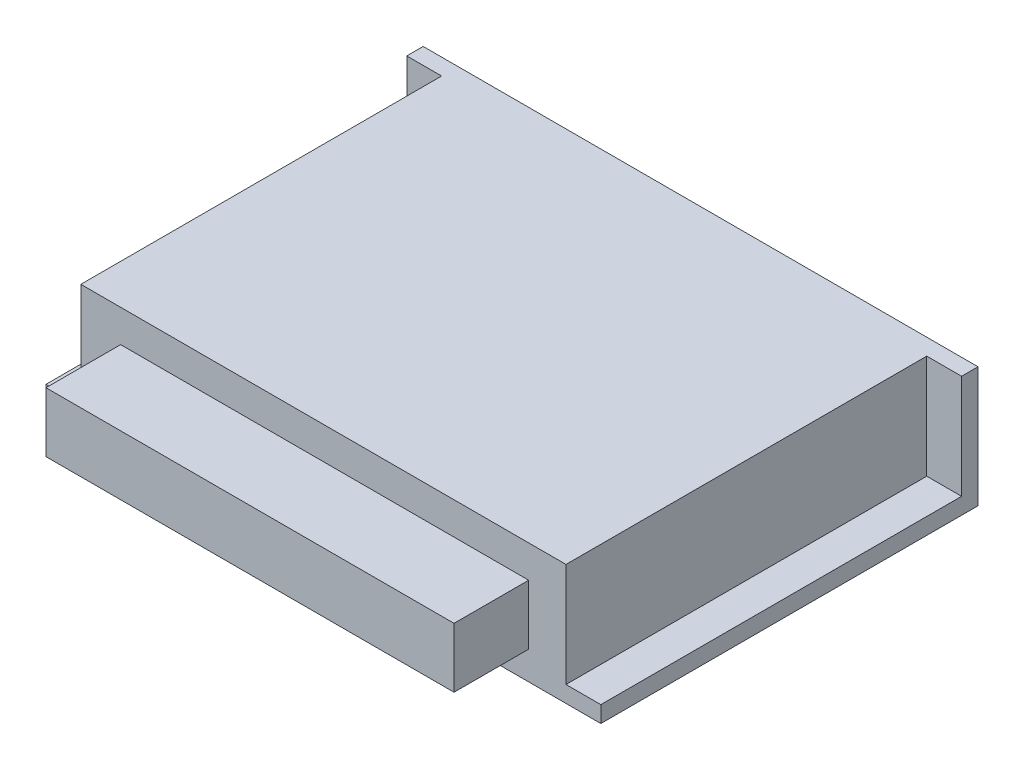
ISO-10303-21;
HEADER;
FILE_DESCRIPTION(('STEP AP214'),'2;1');
FILE_NAME('part.step','',(''),(''),'','','');
FILE_SCHEMA(('AUTOMOTIVE_DESIGN { 1 0 10303 214 1 1 1 1 }'));
ENDSEC;
DATA;
#1=APPLICATION_CONTEXT('core data for automotive mechanical design processes');
#2=APPLICATION_PROTOCOL_DEFINITION('international standard','automotive_design',2000,#1);
#3=PRODUCT_CONTEXT('',#1,'mechanical');
#4=PRODUCT('Part','Part','',(#3));
#5=PRODUCT_RELATED_PRODUCT_CATEGORY('part','',(#4));
#6=PRODUCT_DEFINITION_FORMATION('','',#4);
#7=PRODUCT_DEFINITION_CONTEXT('part definition',#1,'design');
#8=PRODUCT_DEFINITION('design','',#6,#7);
#9=PRODUCT_DEFINITION_SHAPE('','',#8);
#10=(LENGTH_UNIT() NAMED_UNIT(*) SI_UNIT(.MILLI.,.METRE.));
#11=(NAMED_UNIT(*) PLANE_ANGLE_UNIT() SI_UNIT($,.RADIAN.));
#12=(NAMED_UNIT(*) SI_UNIT($,.STERADIAN.) SOLID_ANGLE_UNIT());
#13=UNCERTAINTY_MEASURE_WITH_UNIT(LENGTH_MEASURE(1.E-05),#10,'distance_accuracy_value','');
#14=(GEOMETRIC_REPRESENTATION_CONTEXT(3) GLOBAL_UNCERTAINTY_ASSIGNED_CONTEXT((#13)) GLOBAL_UNIT_ASSIGNED_CONTEXT((#10,
#11,#12)) REPRESENTATION_CONTEXT('',''));
#15=CARTESIAN_POINT('',(0.,0.,0.));
#16=DIRECTION('',(0.,0.,1.));
#17=DIRECTION('',(1.,0.,0.));
#18=AXIS2_PLACEMENT_3D('',#15,#16,#17);
#19=CARTESIAN_POINT('',(-55.75,3.3,37.9));
#20=DIRECTION('',(0.,0.,-1.));
#21=DIRECTION('',(-1.,0.,0.));
#22=AXIS2_PLACEMENT_3D('',#19,#20,#21);
#23=PLANE('',#22);
#24=DIRECTION('',(1.,0.,0.));
#25=VECTOR('',#24,1.);
#26=CARTESIAN_POINT('',(-55.75,0.,37.9));
#27=LINE('',#26,#25);
#28=CARTESIAN_POINT('',(-55.75,0.,37.9));
#29=VERTEX_POINT('',#28);
#30=CARTESIAN_POINT('',(55.75,0.,37.9));
#31=VERTEX_POINT('',#30);
#32=EDGE_CURVE('E216',#29,#31,#27,.T.);
#33=ORIENTED_EDGE('',*,*,#32,.T.);
#34=DIRECTION('',(0.,-1.,0.));
#35=VECTOR('',#34,1.);
#36=CARTESIAN_POINT('',(55.75,3.3,37.9));
#37=LINE('',#36,#35);
#38=CARTESIAN_POINT('',(55.75,3.3,37.9));
#39=VERTEX_POINT('',#38);
#40=EDGE_CURVE('E221',#39,#31,#37,.T.);
#41=ORIENTED_EDGE('',*,*,#40,.F.);
#42=DIRECTION('',(1.,0.,0.));
#43=VECTOR('',#42,1.);
#44=CARTESIAN_POINT('',(-55.75,3.3,37.9));
#45=LINE('',#44,#43);
#46=CARTESIAN_POINT('',(48.75,3.3,37.9));
#47=VERTEX_POINT('',#46);
#48=EDGE_CURVE('E218',#47,#39,#45,.T.);
#49=ORIENTED_EDGE('',*,*,#48,.F.);
#50=DIRECTION('',(0.,-1.,0.));
#51=VECTOR('',#50,1.);
#52=CARTESIAN_POINT('',(48.75,183.225405617784,37.9));
#53=LINE('',#52,#51);
#54=CARTESIAN_POINT('',(48.75,24.2,37.9));
#55=VERTEX_POINT('',#54);
#56=EDGE_CURVE('E193',#55,#47,#53,.T.);
#57=ORIENTED_EDGE('',*,*,#56,.F.);
#58=DIRECTION('',(-1.,0.,0.));
#59=VECTOR('',#58,1.);
#60=CARTESIAN_POINT('',(0.,24.2,37.9));
#61=LINE('',#60,#59);
#62=CARTESIAN_POINT('',(-48.75,24.2,37.9));
#63=VERTEX_POINT('',#62);
#64=EDGE_CURVE('E167',#55,#63,#61,.T.);
#65=ORIENTED_EDGE('',*,*,#64,.T.);
#66=DIRECTION('',(0.,-1.,0.));
#67=VECTOR('',#66,1.);
#68=CARTESIAN_POINT('',(-48.75,183.225405617784,37.9));
#69=LINE('',#68,#67);
#70=CARTESIAN_POINT('',(-48.75,3.3,37.9));
#71=VERTEX_POINT('',#70);
#72=EDGE_CURVE('E196',#63,#71,#69,.T.);
#73=ORIENTED_EDGE('',*,*,#72,.T.);
#74=CARTESIAN_POINT('',(-55.75,3.3,37.9));
#75=VERTEX_POINT('',#74);
#76=EDGE_CURVE('E219',#75,#71,#45,.T.);
#77=ORIENTED_EDGE('',*,*,#76,.F.);
#78=DIRECTION('',(0.,-1.,0.));
#79=VECTOR('',#78,1.);
#80=CARTESIAN_POINT('',(-55.75,3.3,37.9));
#81=LINE('',#80,#79);
#82=EDGE_CURVE('E231',#75,#29,#81,.T.);
#83=ORIENTED_EDGE('',*,*,#82,.T.);
#84=EDGE_LOOP('',(#33,#41,#49,#57,#65,#73,#77,#83));
#85=FACE_BOUND('',#84,.T.);
#86=DIRECTION('',(0.,-1.,0.));
#87=VECTOR('',#86,1.);
#88=CARTESIAN_POINT('',(-40.75,5.7,37.9));
#89=LINE('',#88,#87);
#90=CARTESIAN_POINT('',(-40.75,17.7,37.9));
#91=VERTEX_POINT('',#90);
#92=CARTESIAN_POINT('',(-40.75,5.7,37.9));
#93=VERTEX_POINT('',#92);
#94=EDGE_CURVE('E49',#91,#93,#89,.T.);
#95=ORIENTED_EDGE('',*,*,#94,.F.);
#96=DIRECTION('',(-1.,0.,0.));
#97=VECTOR('',#96,1.);
#98=CARTESIAN_POINT('',(-40.75,17.7,37.9));
#99=LINE('',#98,#97);
#100=CARTESIAN_POINT('',(41.25,17.7,37.9));
#101=VERTEX_POINT('',#100);
#102=EDGE_CURVE('E53',#101,#91,#99,.T.);
#103=ORIENTED_EDGE('',*,*,#102,.F.);
#104=DIRECTION('',(0.,1.,0.));
#105=VECTOR('',#104,1.);
#106=CARTESIAN_POINT('',(41.25,5.7,37.9));
#107=LINE('',#106,#105);
#108=CARTESIAN_POINT('',(41.25,5.7,37.9));
#109=VERTEX_POINT('',#108);
#110=EDGE_CURVE('E442',#109,#101,#107,.T.);
#111=ORIENTED_EDGE('',*,*,#110,.F.);
#112=DIRECTION('',(1.,0.,0.));
#113=VECTOR('',#112,1.);
#114=CARTESIAN_POINT('',(-40.75,5.7,37.9));
#115=LINE('',#114,#113);
#116=EDGE_CURVE('E448',#93,#109,#115,.T.);
#117=ORIENTED_EDGE('',*,*,#116,.F.);
#118=EDGE_LOOP('',(#95,#103,#111,#117));
#119=FACE_BOUND('',#118,.T.);
#120=ADVANCED_FACE('F34',(#85,#119),#23,.F.);
#121=CARTESIAN_POINT('',(0.,3.3,0.));
#122=DIRECTION('',(0.,-1.,0.));
#123=DIRECTION('',(0.,0.,-1.));
#124=AXIS2_PLACEMENT_3D('',#121,#122,#123);
#125=PLANE('',#124);
#126=DIRECTION('',(0.,0.,1.));
#127=VECTOR('',#126,1.);
#128=CARTESIAN_POINT('',(-48.75,3.3,0.));
#129=LINE('',#128,#127);
#130=CARTESIAN_POINT('',(-48.75,3.3,-34.6));
#131=VERTEX_POINT('',#130);
#132=EDGE_CURVE('E190',#131,#71,#129,.T.);
#133=ORIENTED_EDGE('',*,*,#132,.F.);
#134=DIRECTION('',(1.,0.,0.));
#135=VECTOR('',#134,1.);
#136=CARTESIAN_POINT('',(0.,3.3,-34.6));
#137=LINE('',#136,#135);
#138=CARTESIAN_POINT('',(-55.75,3.3,-34.6));
#139=VERTEX_POINT('',#138);
#140=EDGE_CURVE('E187',#139,#131,#137,.T.);
#141=ORIENTED_EDGE('',*,*,#140,.F.);
#142=DIRECTION('',(0.,0.,1.));
#143=VECTOR('',#142,1.);
#144=CARTESIAN_POINT('',(-55.75,3.3,37.9));
#145=LINE('',#144,#143);
#146=EDGE_CURVE('E215',#139,#75,#145,.T.);
#147=ORIENTED_EDGE('',*,*,#146,.T.);
#148=ORIENTED_EDGE('',*,*,#76,.T.);
#149=EDGE_LOOP('',(#133,#141,#147,#148));
#150=FACE_BOUND('',#149,.T.);
#151=ADVANCED_FACE('F268',(#150),#125,.F.);
#152=CARTESIAN_POINT('',(55.75,3.3,37.9));
#153=DIRECTION('',(-1.,0.,0.));
#154=DIRECTION('',(0.,0.,1.));
#155=AXIS2_PLACEMENT_3D('',#152,#153,#154);
#156=PLANE('',#155);
#157=DIRECTION('',(0.,0.,-1.));
#158=VECTOR('',#157,1.);
#159=CARTESIAN_POINT('',(55.75,0.,37.9));
#160=LINE('',#159,#158);
#161=CARTESIAN_POINT('',(55.75,0.,-37.9));
#162=VERTEX_POINT('',#161);
#163=EDGE_CURVE('E183',#31,#162,#160,.T.);
#164=ORIENTED_EDGE('',*,*,#163,.T.);
#165=DIRECTION('',(0.,-1.,0.));
#166=VECTOR('',#165,1.);
#167=CARTESIAN_POINT('',(55.75,3.3,-37.9));
#168=LINE('',#167,#166);
#169=CARTESIAN_POINT('',(55.75,24.2,-37.9));
#170=VERTEX_POINT('',#169);
#171=EDGE_CURVE('E12',#170,#162,#168,.T.);
#172=ORIENTED_EDGE('',*,*,#171,.F.);
#173=DIRECTION('',(0.,0.,1.));
#174=VECTOR('',#173,1.);
#175=CARTESIAN_POINT('',(55.75,24.2,0.));
#176=LINE('',#175,#174);
#177=CARTESIAN_POINT('',(55.75,24.2,-34.6));
#178=VERTEX_POINT('',#177);
#179=EDGE_CURVE('E176',#170,#178,#176,.T.);
#180=ORIENTED_EDGE('',*,*,#179,.T.);
#181=DIRECTION('',(0.,-1.,0.));
#182=VECTOR('',#181,1.);
#183=CARTESIAN_POINT('',(55.75,183.225405617784,-34.6));
#184=LINE('',#183,#182);
#185=CARTESIAN_POINT('',(55.75,3.3,-34.6));
#186=VERTEX_POINT('',#185);
#187=EDGE_CURVE('E205',#178,#186,#184,.T.);
#188=ORIENTED_EDGE('',*,*,#187,.T.);
#189=DIRECTION('',(0.,0.,-1.));
#190=VECTOR('',#189,1.);
#191=CARTESIAN_POINT('',(55.75,3.3,37.9));
#192=LINE('',#191,#190);
#193=EDGE_CURVE('E213',#39,#186,#192,.T.);
#194=ORIENTED_EDGE('',*,*,#193,.F.);
#195=ORIENTED_EDGE('',*,*,#40,.T.);
#196=EDGE_LOOP('',(#164,#172,#180,#188,#194,#195));
#197=FACE_BOUND('',#196,.T.);
#198=ADVANCED_FACE('F36',(#197),#156,.F.);
#199=CARTESIAN_POINT('',(-55.75,3.3,-37.9));
#200=DIRECTION('',(0.,0.,1.));
#201=DIRECTION('',(1.,0.,0.));
#202=AXIS2_PLACEMENT_3D('',#199,#200,#201);
#203=PLANE('',#202);
#204=DIRECTION('',(-1.,0.,0.));
#205=VECTOR('',#204,1.);
#206=CARTESIAN_POINT('',(-55.75,0.,-37.9));
#207=LINE('',#206,#205);
#208=CARTESIAN_POINT('',(-55.75,0.,-37.9));
#209=VERTEX_POINT('',#208);
#210=EDGE_CURVE('E224',#162,#209,#207,.T.);
#211=ORIENTED_EDGE('',*,*,#210,.T.);
#212=DIRECTION('',(0.,-1.,0.));
#213=VECTOR('',#212,1.);
#214=CARTESIAN_POINT('',(-55.75,3.3,-37.9));
#215=LINE('',#214,#213);
#216=CARTESIAN_POINT('',(-55.75,24.2,-37.9));
#217=VERTEX_POINT('',#216);
#218=EDGE_CURVE('E42',#217,#209,#215,.T.);
#219=ORIENTED_EDGE('',*,*,#218,.F.);
#220=DIRECTION('',(1.,0.,0.));
#221=VECTOR('',#220,1.);
#222=CARTESIAN_POINT('',(0.,24.2,-37.9));
#223=LINE('',#222,#221);
#224=EDGE_CURVE('E173',#217,#170,#223,.T.);
#225=ORIENTED_EDGE('',*,*,#224,.T.);
#226=ORIENTED_EDGE('',*,*,#171,.T.);
#227=EDGE_LOOP('',(#211,#219,#225,#226));
#228=FACE_BOUND('',#227,.T.);
#229=ADVANCED_FACE('F272',(#228),#203,.F.);
#230=CARTESIAN_POINT('',(-55.75,3.3,37.9));
#231=DIRECTION('',(1.,0.,0.));
#232=DIRECTION('',(0.,0.,-1.));
#233=AXIS2_PLACEMENT_3D('',#230,#231,#232);
#234=PLANE('',#233);
#235=DIRECTION('',(0.,0.,1.));
#236=VECTOR('',#235,1.);
#237=CARTESIAN_POINT('',(-55.75,0.,37.9));
#238=LINE('',#237,#236);
#239=EDGE_CURVE('E226',#209,#29,#238,.T.);
#240=ORIENTED_EDGE('',*,*,#239,.T.);
#241=ORIENTED_EDGE('',*,*,#82,.F.);
#242=ORIENTED_EDGE('',*,*,#146,.F.);
#243=DIRECTION('',(0.,-1.,0.));
#244=VECTOR('',#243,1.);
#245=CARTESIAN_POINT('',(-55.75,183.225405617784,-34.6));
#246=LINE('',#245,#244);
#247=CARTESIAN_POINT('',(-55.75,24.2,-34.6));
#248=VERTEX_POINT('',#247);
#249=EDGE_CURVE('E202',#248,#139,#246,.T.);
#250=ORIENTED_EDGE('',*,*,#249,.F.);
#251=DIRECTION('',(0.,0.,-1.));
#252=VECTOR('',#251,1.);
#253=CARTESIAN_POINT('',(-55.75,24.2,0.));
#254=LINE('',#253,#252);
#255=EDGE_CURVE('E170',#248,#217,#254,.T.);
#256=ORIENTED_EDGE('',*,*,#255,.T.);
#257=ORIENTED_EDGE('',*,*,#218,.T.);
#258=EDGE_LOOP('',(#240,#241,#242,#250,#256,#257));
#259=FACE_BOUND('',#258,.T.);
#260=ADVANCED_FACE('F236',(#259),#234,.F.);
#261=DIRECTION('',(1.,0.,0.));
#262=VECTOR('',#261,1.);
#263=CARTESIAN_POINT('',(0.,3.3,-34.6));
#264=LINE('',#263,#262);
#265=CARTESIAN_POINT('',(48.75,3.3,-34.6));
#266=VERTEX_POINT('',#265);
#267=EDGE_CURVE('E157',#266,#186,#264,.T.);
#268=ORIENTED_EDGE('',*,*,#267,.F.);
#269=DIRECTION('',(0.,0.,1.));
#270=VECTOR('',#269,1.);
#271=CARTESIAN_POINT('',(48.75,3.3,0.));
#272=LINE('',#271,#270);
#273=EDGE_CURVE('E155',#266,#47,#272,.T.);
#274=ORIENTED_EDGE('',*,*,#273,.T.);
#275=ORIENTED_EDGE('',*,*,#48,.T.);
#276=ORIENTED_EDGE('',*,*,#193,.T.);
#277=EDGE_LOOP('',(#268,#274,#275,#276));
#278=FACE_BOUND('',#277,.T.);
#279=ADVANCED_FACE('F253',(#278),#125,.F.);
#280=CARTESIAN_POINT('',(0.,0.,0.));
#281=DIRECTION('',(0.,-1.,0.));
#282=DIRECTION('',(0.,0.,-1.));
#283=AXIS2_PLACEMENT_3D('',#280,#281,#282);
#284=PLANE('',#283);
#285=ORIENTED_EDGE('',*,*,#163,.F.);
#286=ORIENTED_EDGE('',*,*,#32,.F.);
#287=ORIENTED_EDGE('',*,*,#239,.F.);
#288=ORIENTED_EDGE('',*,*,#210,.F.);
#289=EDGE_LOOP('',(#285,#286,#287,#288));
#290=FACE_BOUND('',#289,.T.);
#291=ADVANCED_FACE('F244',(#290),#284,.T.);
#292=CARTESIAN_POINT('',(-48.75,183.225405617784,0.));
#293=DIRECTION('',(1.,0.,0.));
#294=DIRECTION('',(0.,0.,-1.));
#295=AXIS2_PLACEMENT_3D('',#292,#293,#294);
#296=PLANE('',#295);
#297=ORIENTED_EDGE('',*,*,#72,.F.);
#298=DIRECTION('',(0.,0.,-1.));
#299=VECTOR('',#298,1.);
#300=CARTESIAN_POINT('',(-48.75,24.2,0.));
#301=LINE('',#300,#299);
#302=CARTESIAN_POINT('',(-48.75,24.2,-34.6));
#303=VERTEX_POINT('',#302);
#304=EDGE_CURVE('E163',#63,#303,#301,.T.);
#305=ORIENTED_EDGE('',*,*,#304,.T.);
#306=DIRECTION('',(0.,-1.,0.));
#307=VECTOR('',#306,1.);
#308=CARTESIAN_POINT('',(-48.75,183.225405617784,-34.6));
#309=LINE('',#308,#307);
#310=EDGE_CURVE('E199',#303,#131,#309,.T.);
#311=ORIENTED_EDGE('',*,*,#310,.T.);
#312=ORIENTED_EDGE('',*,*,#132,.T.);
#313=EDGE_LOOP('',(#297,#305,#311,#312));
#314=FACE_BOUND('',#313,.T.);
#315=ADVANCED_FACE('F265',(#314),#296,.F.);
#316=CARTESIAN_POINT('',(0.,183.225405617784,-34.6));
#317=DIRECTION('',(0.,0.,-1.));
#318=DIRECTION('',(-1.,0.,0.));
#319=AXIS2_PLACEMENT_3D('',#316,#317,#318);
#320=PLANE('',#319);
#321=ORIENTED_EDGE('',*,*,#310,.F.);
#322=DIRECTION('',(-1.,0.,0.));
#323=VECTOR('',#322,1.);
#324=CARTESIAN_POINT('',(0.,24.2,-34.6));
#325=LINE('',#324,#323);
#326=EDGE_CURVE('E166',#303,#248,#325,.T.);
#327=ORIENTED_EDGE('',*,*,#326,.T.);
#328=ORIENTED_EDGE('',*,*,#249,.T.);
#329=ORIENTED_EDGE('',*,*,#140,.T.);
#330=EDGE_LOOP('',(#321,#327,#328,#329));
#331=FACE_BOUND('',#330,.T.);
#332=ADVANCED_FACE('F271',(#331),#320,.F.);
#333=CARTESIAN_POINT('',(0.,183.225405617784,-34.6));
#334=DIRECTION('',(0.,0.,-1.));
#335=DIRECTION('',(-1.,0.,0.));
#336=AXIS2_PLACEMENT_3D('',#333,#334,#335);
#337=PLANE('',#336);
#338=ORIENTED_EDGE('',*,*,#187,.F.);
#339=DIRECTION('',(-1.,0.,0.));
#340=VECTOR('',#339,1.);
#341=CARTESIAN_POINT('',(0.,24.2,-34.6));
#342=LINE('',#341,#340);
#343=CARTESIAN_POINT('',(48.75,24.2,-34.6));
#344=VERTEX_POINT('',#343);
#345=EDGE_CURVE('E179',#178,#344,#342,.T.);
#346=ORIENTED_EDGE('',*,*,#345,.T.);
#347=DIRECTION('',(0.,-1.,0.));
#348=VECTOR('',#347,1.);
#349=CARTESIAN_POINT('',(48.75,183.225405617784,-34.6));
#350=LINE('',#349,#348);
#351=EDGE_CURVE('E208',#344,#266,#350,.T.);
#352=ORIENTED_EDGE('',*,*,#351,.T.);
#353=ORIENTED_EDGE('',*,*,#267,.T.);
#354=EDGE_LOOP('',(#338,#346,#352,#353));
#355=FACE_BOUND('',#354,.T.);
#356=ADVANCED_FACE('F291',(#355),#337,.F.);
#357=CARTESIAN_POINT('',(48.75,183.225405617784,0.));
#358=DIRECTION('',(1.,0.,0.));
#359=DIRECTION('',(0.,0.,-1.));
#360=AXIS2_PLACEMENT_3D('',#357,#358,#359);
#361=PLANE('',#360);
#362=DIRECTION('',(0.,0.,-1.));
#363=VECTOR('',#362,1.);
#364=CARTESIAN_POINT('',(48.75,24.2,0.));
#365=LINE('',#364,#363);
#366=EDGE_CURVE('E182',#55,#344,#365,.T.);
#367=ORIENTED_EDGE('',*,*,#366,.F.);
#368=ORIENTED_EDGE('',*,*,#56,.T.);
#369=ORIENTED_EDGE('',*,*,#273,.F.);
#370=ORIENTED_EDGE('',*,*,#351,.F.);
#371=EDGE_LOOP('',(#367,#368,#369,#370));
#372=FACE_BOUND('',#371,.T.);
#373=ADVANCED_FACE('F258',(#372),#361,.T.);
#374=CARTESIAN_POINT('',(0.,24.2,0.));
#375=DIRECTION('',(0.,-1.,0.));
#376=DIRECTION('',(0.,0.,-1.));
#377=AXIS2_PLACEMENT_3D('',#374,#375,#376);
#378=PLANE('',#377);
#379=ORIENTED_EDGE('',*,*,#366,.T.);
#380=ORIENTED_EDGE('',*,*,#345,.F.);
#381=ORIENTED_EDGE('',*,*,#179,.F.);
#382=ORIENTED_EDGE('',*,*,#224,.F.);
#383=ORIENTED_EDGE('',*,*,#255,.F.);
#384=ORIENTED_EDGE('',*,*,#326,.F.);
#385=ORIENTED_EDGE('',*,*,#304,.F.);
#386=ORIENTED_EDGE('',*,*,#64,.F.);
#387=EDGE_LOOP('',(#379,#380,#381,#382,#383,#384,#385,#386));
#388=FACE_BOUND('',#387,.T.);
#389=ADVANCED_FACE('F261',(#388),#378,.F.);
#390=CARTESIAN_POINT('',(-40.75,5.7,52.9));
#391=DIRECTION('',(1.,0.,0.));
#392=DIRECTION('',(0.,0.,-1.));
#393=AXIS2_PLACEMENT_3D('',#390,#391,#392);
#394=PLANE('',#393);
#395=ORIENTED_EDGE('',*,*,#94,.T.);
#396=DIRECTION('',(0.,0.,-1.));
#397=VECTOR('',#396,1.);
#398=CARTESIAN_POINT('',(-40.75,5.7,52.9));
#399=LINE('',#398,#397);
#400=CARTESIAN_POINT('',(-40.75,5.7,52.9));
#401=VERTEX_POINT('',#400);
#402=EDGE_CURVE('E138',#401,#93,#399,.T.);
#403=ORIENTED_EDGE('',*,*,#402,.F.);
#404=DIRECTION('',(0.,-1.,0.));
#405=VECTOR('',#404,1.);
#406=CARTESIAN_POINT('',(-40.75,5.7,52.9));
#407=LINE('',#406,#405);
#408=CARTESIAN_POINT('',(-40.75,17.7,52.9));
#409=VERTEX_POINT('',#408);
#410=EDGE_CURVE('E144',#409,#401,#407,.T.);
#411=ORIENTED_EDGE('',*,*,#410,.F.);
#412=DIRECTION('',(0.,0.,-1.));
#413=VECTOR('',#412,1.);
#414=CARTESIAN_POINT('',(-40.75,17.7,52.9));
#415=LINE('',#414,#413);
#416=EDGE_CURVE('E440',#409,#91,#415,.T.);
#417=ORIENTED_EDGE('',*,*,#416,.T.);
#418=EDGE_LOOP('',(#395,#403,#411,#417));
#419=FACE_BOUND('',#418,.T.);
#420=ADVANCED_FACE('F154',(#419),#394,.F.);
#421=CARTESIAN_POINT('',(-40.75,5.7,52.9));
#422=DIRECTION('',(0.,1.,0.));
#423=DIRECTION('',(0.,0.,1.));
#424=AXIS2_PLACEMENT_3D('',#421,#422,#423);
#425=PLANE('',#424);
#426=ORIENTED_EDGE('',*,*,#116,.T.);
#427=DIRECTION('',(0.,0.,-1.));
#428=VECTOR('',#427,1.);
#429=CARTESIAN_POINT('',(41.25,5.7,52.9));
#430=LINE('',#429,#428);
#431=CARTESIAN_POINT('',(41.25,5.7,52.9));
#432=VERTEX_POINT('',#431);
#433=EDGE_CURVE('E140',#432,#109,#430,.T.);
#434=ORIENTED_EDGE('',*,*,#433,.F.);
#435=DIRECTION('',(1.,0.,0.));
#436=VECTOR('',#435,1.);
#437=CARTESIAN_POINT('',(-40.75,5.7,52.9));
#438=LINE('',#437,#436);
#439=EDGE_CURVE('E133',#401,#432,#438,.T.);
#440=ORIENTED_EDGE('',*,*,#439,.F.);
#441=ORIENTED_EDGE('',*,*,#402,.T.);
#442=EDGE_LOOP('',(#426,#434,#440,#441));
#443=FACE_BOUND('',#442,.T.);
#444=ADVANCED_FACE('F136',(#443),#425,.F.);
#445=CARTESIAN_POINT('',(41.25,5.7,52.9));
#446=DIRECTION('',(-1.,0.,0.));
#447=DIRECTION('',(0.,0.,1.));
#448=AXIS2_PLACEMENT_3D('',#445,#446,#447);
#449=PLANE('',#448);
#450=ORIENTED_EDGE('',*,*,#110,.T.);
#451=DIRECTION('',(0.,0.,-1.));
#452=VECTOR('',#451,1.);
#453=CARTESIAN_POINT('',(41.25,17.7,52.9));
#454=LINE('',#453,#452);
#455=CARTESIAN_POINT('',(41.25,17.7,52.9));
#456=VERTEX_POINT('',#455);
#457=EDGE_CURVE('E159',#456,#101,#454,.T.);
#458=ORIENTED_EDGE('',*,*,#457,.F.);
#459=DIRECTION('',(0.,1.,0.));
#460=VECTOR('',#459,1.);
#461=CARTESIAN_POINT('',(41.25,5.7,52.9));
#462=LINE('',#461,#460);
#463=EDGE_CURVE('E143',#432,#456,#462,.T.);
#464=ORIENTED_EDGE('',*,*,#463,.F.);
#465=ORIENTED_EDGE('',*,*,#433,.T.);
#466=EDGE_LOOP('',(#450,#458,#464,#465));
#467=FACE_BOUND('',#466,.T.);
#468=ADVANCED_FACE('F305',(#467),#449,.F.);
#469=CARTESIAN_POINT('',(-40.75,17.7,52.9));
#470=DIRECTION('',(0.,-1.,0.));
#471=DIRECTION('',(0.,0.,-1.));
#472=AXIS2_PLACEMENT_3D('',#469,#470,#471);
#473=PLANE('',#472);
#474=ORIENTED_EDGE('',*,*,#102,.T.);
#475=ORIENTED_EDGE('',*,*,#416,.F.);
#476=DIRECTION('',(-1.,0.,0.));
#477=VECTOR('',#476,1.);
#478=CARTESIAN_POINT('',(-40.75,17.7,52.9));
#479=LINE('',#478,#477);
#480=EDGE_CURVE('E149',#456,#409,#479,.T.);
#481=ORIENTED_EDGE('',*,*,#480,.F.);
#482=ORIENTED_EDGE('',*,*,#457,.T.);
#483=EDGE_LOOP('',(#474,#475,#481,#482));
#484=FACE_BOUND('',#483,.T.);
#485=ADVANCED_FACE('F308',(#484),#473,.F.);
#486=CARTESIAN_POINT('',(0.,0.,52.9));
#487=DIRECTION('',(0.,0.,-1.));
#488=DIRECTION('',(-1.,0.,0.));
#489=AXIS2_PLACEMENT_3D('',#486,#487,#488);
#490=PLANE('',#489);
#491=ORIENTED_EDGE('',*,*,#410,.T.);
#492=ORIENTED_EDGE('',*,*,#439,.T.);
#493=ORIENTED_EDGE('',*,*,#463,.T.);
#494=ORIENTED_EDGE('',*,*,#480,.T.);
#495=EDGE_LOOP('',(#491,#492,#493,#494));
#496=FACE_BOUND('',#495,.T.);
#497=ADVANCED_FACE('F147',(#496),#490,.F.);
#498=CLOSED_SHELL('',(#120,#151,#198,#229,#260,#279,#291,#315,#332,#356,#373,#389,#420,#444,
#468,#485,#497));
#499=MANIFOLD_SOLID_BREP('B2',#498);
#500=ADVANCED_BREP_SHAPE_REPRESENTATION('',(#18,#499),#14);
#501=SHAPE_DEFINITION_REPRESENTATION(#9,#500);
ENDSEC;
END-ISO-10303-21;
